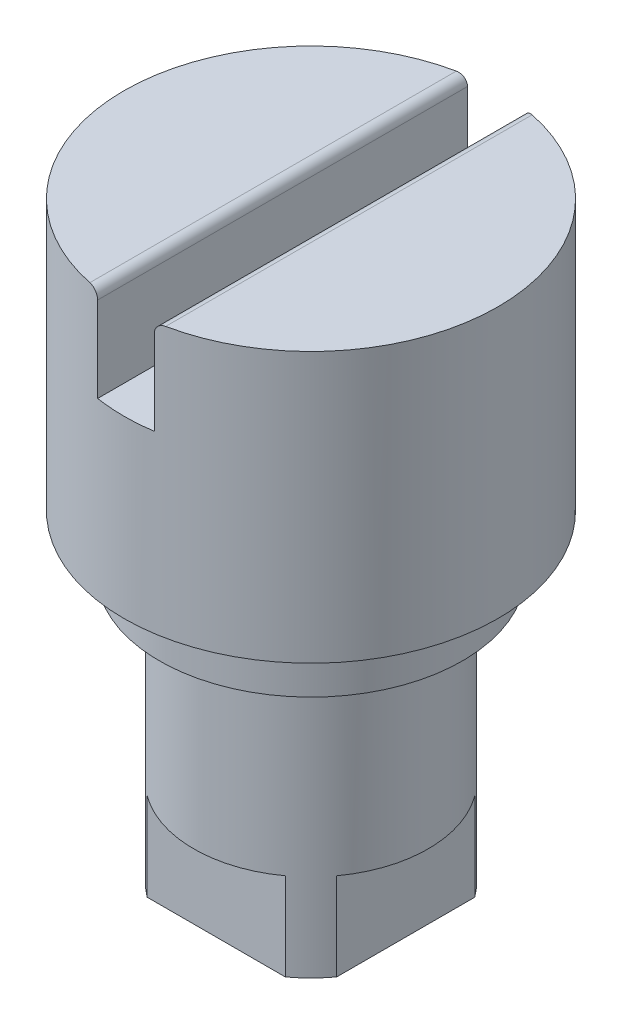
ISO-10303-21;
HEADER;
FILE_DESCRIPTION(('STEP AP214'),'2;1');
FILE_NAME('part.step','',(''),(''),'','','');
FILE_SCHEMA(('AUTOMOTIVE_DESIGN { 1 0 10303 214 1 1 1 1 }'));
ENDSEC;
DATA;
#1=APPLICATION_CONTEXT('core data for automotive mechanical design processes');
#2=APPLICATION_PROTOCOL_DEFINITION('international standard','automotive_design',2000,#1);
#3=PRODUCT_CONTEXT('',#1,'mechanical');
#4=PRODUCT('Part','Part','',(#3));
#5=PRODUCT_RELATED_PRODUCT_CATEGORY('part','',(#4));
#6=PRODUCT_DEFINITION_FORMATION('','',#4);
#7=PRODUCT_DEFINITION_CONTEXT('part definition',#1,'design');
#8=PRODUCT_DEFINITION('design','',#6,#7);
#9=PRODUCT_DEFINITION_SHAPE('','',#8);
#10=(LENGTH_UNIT() NAMED_UNIT(*) SI_UNIT(.MILLI.,.METRE.));
#11=(NAMED_UNIT(*) PLANE_ANGLE_UNIT() SI_UNIT($,.RADIAN.));
#12=(NAMED_UNIT(*) SI_UNIT($,.STERADIAN.) SOLID_ANGLE_UNIT());
#13=UNCERTAINTY_MEASURE_WITH_UNIT(LENGTH_MEASURE(1.E-05),#10,'distance_accuracy_value','');
#14=(GEOMETRIC_REPRESENTATION_CONTEXT(3) GLOBAL_UNCERTAINTY_ASSIGNED_CONTEXT((#13)) GLOBAL_UNIT_ASSIGNED_CONTEXT((#10,
#11,#12)) REPRESENTATION_CONTEXT('',''));
#15=CARTESIAN_POINT('',(0.,0.,0.));
#16=DIRECTION('',(0.,0.,1.));
#17=DIRECTION('',(1.,0.,0.));
#18=AXIS2_PLACEMENT_3D('',#15,#16,#17);
#19=CARTESIAN_POINT('',(0.,1.4,0.));
#20=DIRECTION('',(0.,1.,0.));
#21=DIRECTION('',(0.,0.,1.));
#22=AXIS2_PLACEMENT_3D('',#19,#20,#21);
#23=PLANE('',#22);
#24=CARTESIAN_POINT('',(0.,1.4,0.));
#25=DIRECTION('',(0.,1.,0.));
#26=DIRECTION('',(0.,0.,1.));
#27=AXIS2_PLACEMENT_3D('',#24,#25,#26);
#28=CIRCLE('',#27,2.5);
#29=CARTESIAN_POINT('',(0.,1.4,2.5));
#30=VERTEX_POINT('',#29);
#31=EDGE_CURVE('E20',#30,#30,#28,.F.);
#32=ORIENTED_EDGE('',*,*,#31,.T.);
#33=EDGE_LOOP('',(#32));
#34=FACE_BOUND('',#33,.T.);
#35=ADVANCED_FACE('F17',(#34),#23,.F.);
#36=CARTESIAN_POINT('',(0.,-13.6,0.));
#37=DIRECTION('',(0.,1.,0.));
#38=DIRECTION('',(0.,0.,1.));
#39=AXIS2_PLACEMENT_3D('',#36,#37,#38);
#40=CYLINDRICAL_SURFACE('',#39,2.5);
#41=ORIENTED_EDGE('',*,*,#31,.F.);
#42=EDGE_LOOP('',(#41));
#43=FACE_BOUND('',#42,.T.);
#44=CARTESIAN_POINT('',(0.,-12.7999999999133,0.));
#45=DIRECTION('',(0.,-1.,0.));
#46=DIRECTION('',(1.,0.,0.));
#47=AXIS2_PLACEMENT_3D('',#44,#45,#46);
#48=CIRCLE('',#47,2.50000000005457);
#49=CARTESIAN_POINT('',(2.50000000005457,-12.7999999999133,0.));
#50=VERTEX_POINT('',#49);
#51=EDGE_CURVE('E129',#50,#50,#48,.T.);
#52=ORIENTED_EDGE('',*,*,#51,.T.);
#53=EDGE_LOOP('',(#52));
#54=FACE_BOUND('',#53,.T.);
#55=ADVANCED_FACE('F289',(#43,#54),#40,.F.);
#56=CARTESIAN_POINT('',(0.,-13.5999999999967,0.));
#57=DIRECTION('',(0.,-1.,0.));
#58=DIRECTION('',(0.,0.,-1.));
#59=AXIS2_PLACEMENT_3D('',#56,#57,#58);
#60=CONICAL_SURFACE('',#59,3.30000000008113,0.785398163361921);
#61=ORIENTED_EDGE('',*,*,#51,.F.);
#62=EDGE_LOOP('',(#61));
#63=FACE_BOUND('',#62,.T.);
#64=CARTESIAN_POINT('',(0.,-13.5999999999967,0.));
#65=DIRECTION('',(0.,-1.,0.));
#66=DIRECTION('',(0.,0.,-1.));
#67=AXIS2_PLACEMENT_3D('',#64,#65,#66);
#68=CIRCLE('',#67,3.30000000008113);
#69=CARTESIAN_POINT('',(0.,-13.5999999999967,-3.30000000008113));
#70=VERTEX_POINT('',#69);
#71=EDGE_CURVE('E163',#70,#70,#68,.F.);
#72=ORIENTED_EDGE('',*,*,#71,.F.);
#73=EDGE_LOOP('',(#72));
#74=FACE_BOUND('',#73,.T.);
#75=ADVANCED_FACE('F286',(#63,#74),#60,.F.);
#76=CARTESIAN_POINT('',(0.,-13.6,0.));
#77=DIRECTION('',(0.,-1.,0.));
#78=DIRECTION('',(0.,0.,-1.));
#79=AXIS2_PLACEMENT_3D('',#76,#77,#78);
#80=PLANE('',#79);
#81=ORIENTED_EDGE('',*,*,#71,.T.);
#82=EDGE_LOOP('',(#81));
#83=FACE_BOUND('',#82,.T.);
#84=DIRECTION('',(-1.,0.,0.));
#85=VECTOR('',#84,1.);
#86=CARTESIAN_POINT('',(-4.,-13.6,4.));
#87=LINE('',#86,#85);
#88=CARTESIAN_POINT('',(2.91590466236478,-13.6,3.99999999999992));
#89=VERTEX_POINT('',#88);
#90=CARTESIAN_POINT('',(-2.91590466236478,-13.6,3.99999999999992));
#91=VERTEX_POINT('',#90);
#92=EDGE_CURVE('E168',#89,#91,#87,.T.);
#93=ORIENTED_EDGE('',*,*,#92,.T.);
#94=CARTESIAN_POINT('',(0.,-13.6,0.));
#95=DIRECTION('',(0.,-1.,0.));
#96=DIRECTION('',(0.,0.,-1.));
#97=AXIS2_PLACEMENT_3D('',#94,#95,#96);
#98=CIRCLE('',#97,4.95);
#99=CARTESIAN_POINT('',(-3.99999999999992,-13.6,2.91590466236478));
#100=VERTEX_POINT('',#99);
#101=EDGE_CURVE('E305',#91,#100,#98,.T.);
#102=ORIENTED_EDGE('',*,*,#101,.T.);
#103=DIRECTION('',(0.,0.,-1.));
#104=VECTOR('',#103,1.);
#105=CARTESIAN_POINT('',(-4.,-13.6,-4.));
#106=LINE('',#105,#104);
#107=CARTESIAN_POINT('',(-3.99999999999992,-13.6,-2.91590466236477));
#108=VERTEX_POINT('',#107);
#109=EDGE_CURVE('E126',#100,#108,#106,.T.);
#110=ORIENTED_EDGE('',*,*,#109,.T.);
#111=CARTESIAN_POINT('',(0.,-13.6,0.));
#112=DIRECTION('',(0.,-1.,0.));
#113=DIRECTION('',(0.,0.,-1.));
#114=AXIS2_PLACEMENT_3D('',#111,#112,#113);
#115=CIRCLE('',#114,4.95);
#116=CARTESIAN_POINT('',(-2.91590466236478,-13.6,-3.99999999999992));
#117=VERTEX_POINT('',#116);
#118=EDGE_CURVE('E116',#108,#117,#115,.T.);
#119=ORIENTED_EDGE('',*,*,#118,.T.);
#120=DIRECTION('',(1.,0.,0.));
#121=VECTOR('',#120,1.);
#122=CARTESIAN_POINT('',(4.,-13.6,-4.));
#123=LINE('',#122,#121);
#124=CARTESIAN_POINT('',(2.91590466236478,-13.6,-3.99999999999992));
#125=VERTEX_POINT('',#124);
#126=EDGE_CURVE('E123',#117,#125,#123,.T.);
#127=ORIENTED_EDGE('',*,*,#126,.T.);
#128=CARTESIAN_POINT('',(0.,-13.6,0.));
#129=DIRECTION('',(0.,-1.,0.));
#130=DIRECTION('',(0.,0.,-1.));
#131=AXIS2_PLACEMENT_3D('',#128,#129,#130);
#132=CIRCLE('',#131,4.95);
#133=CARTESIAN_POINT('',(3.99999999999992,-13.6,-2.91590466236478));
#134=VERTEX_POINT('',#133);
#135=EDGE_CURVE('E128',#125,#134,#132,.T.);
#136=ORIENTED_EDGE('',*,*,#135,.T.);
#137=DIRECTION('',(0.,0.,1.));
#138=VECTOR('',#137,1.);
#139=CARTESIAN_POINT('',(4.,-13.6,4.));
#140=LINE('',#139,#138);
#141=CARTESIAN_POINT('',(3.99999999999992,-13.6,2.91590466236478));
#142=VERTEX_POINT('',#141);
#143=EDGE_CURVE('E151',#134,#142,#140,.T.);
#144=ORIENTED_EDGE('',*,*,#143,.T.);
#145=CARTESIAN_POINT('',(0.,-13.6,0.));
#146=DIRECTION('',(0.,-1.,0.));
#147=DIRECTION('',(0.,0.,-1.));
#148=AXIS2_PLACEMENT_3D('',#145,#146,#147);
#149=CIRCLE('',#148,4.95);
#150=EDGE_CURVE('E307',#142,#89,#149,.T.);
#151=ORIENTED_EDGE('',*,*,#150,.T.);
#152=EDGE_LOOP('',(#93,#102,#110,#119,#127,#136,#144,#151));
#153=FACE_BOUND('',#152,.T.);
#154=ADVANCED_FACE('F122',(#83,#153),#80,.T.);
#155=CARTESIAN_POINT('',(0.,-9.9,0.));
#156=DIRECTION('',(0.,-1.,0.));
#157=DIRECTION('',(0.,0.,-1.));
#158=AXIS2_PLACEMENT_3D('',#155,#156,#157);
#159=PLANE('',#158);
#160=CARTESIAN_POINT('',(0.,-9.9,0.));
#161=DIRECTION('',(0.,-1.,0.));
#162=DIRECTION('',(0.,0.,-1.));
#163=AXIS2_PLACEMENT_3D('',#160,#161,#162);
#164=CIRCLE('',#163,4.95);
#165=CARTESIAN_POINT('',(-2.91590466236478,-9.9,3.99999999999992));
#166=VERTEX_POINT('',#165);
#167=CARTESIAN_POINT('',(2.91590466236478,-9.9,3.99999999999992));
#168=VERTEX_POINT('',#167);
#169=EDGE_CURVE('E176',#166,#168,#164,.F.);
#170=ORIENTED_EDGE('',*,*,#169,.F.);
#171=DIRECTION('',(-1.,0.,0.));
#172=VECTOR('',#171,1.);
#173=CARTESIAN_POINT('',(-4.,-9.9,4.));
#174=LINE('',#173,#172);
#175=EDGE_CURVE('E166',#166,#168,#174,.F.);
#176=ORIENTED_EDGE('',*,*,#175,.T.);
#177=EDGE_LOOP('',(#170,#176));
#178=FACE_BOUND('',#177,.T.);
#179=ADVANCED_FACE('F279',(#178),#159,.T.);
#180=CARTESIAN_POINT('',(0.,-9.9,0.));
#181=DIRECTION('',(0.,-1.,0.));
#182=DIRECTION('',(0.,0.,-1.));
#183=AXIS2_PLACEMENT_3D('',#180,#181,#182);
#184=PLANE('',#183);
#185=CARTESIAN_POINT('',(0.,-9.9,0.));
#186=DIRECTION('',(0.,-1.,0.));
#187=DIRECTION('',(0.,0.,-1.));
#188=AXIS2_PLACEMENT_3D('',#185,#186,#187);
#189=CIRCLE('',#188,4.95);
#190=CARTESIAN_POINT('',(3.99999999999992,-9.9,2.91590466236478));
#191=VERTEX_POINT('',#190);
#192=CARTESIAN_POINT('',(3.99999999999992,-9.9,-2.91590466236478));
#193=VERTEX_POINT('',#192);
#194=EDGE_CURVE('E156',#191,#193,#189,.F.);
#195=ORIENTED_EDGE('',*,*,#194,.F.);
#196=DIRECTION('',(0.,0.,1.));
#197=VECTOR('',#196,1.);
#198=CARTESIAN_POINT('',(4.,-9.9,4.));
#199=LINE('',#198,#197);
#200=EDGE_CURVE('E161',#191,#193,#199,.F.);
#201=ORIENTED_EDGE('',*,*,#200,.T.);
#202=EDGE_LOOP('',(#195,#201));
#203=FACE_BOUND('',#202,.T.);
#204=ADVANCED_FACE('F275',(#203),#184,.T.);
#205=CARTESIAN_POINT('',(4.,-13.6,4.));
#206=DIRECTION('',(-1.,0.,0.));
#207=DIRECTION('',(0.,0.,1.));
#208=AXIS2_PLACEMENT_3D('',#205,#206,#207);
#209=PLANE('',#208);
#210=DIRECTION('',(0.,-1.,0.));
#211=VECTOR('',#210,1.);
#212=CARTESIAN_POINT('',(3.99999999999984,-2.3,-2.91590466236488));
#213=LINE('',#212,#211);
#214=EDGE_CURVE('E158',#193,#134,#213,.T.);
#215=ORIENTED_EDGE('',*,*,#214,.F.);
#216=ORIENTED_EDGE('',*,*,#200,.F.);
#217=DIRECTION('',(0.,-1.,0.));
#218=VECTOR('',#217,1.);
#219=CARTESIAN_POINT('',(3.99999999999984,-2.3,2.91590466236488));
#220=LINE('',#219,#218);
#221=EDGE_CURVE('E153',#142,#191,#220,.F.);
#222=ORIENTED_EDGE('',*,*,#221,.F.);
#223=ORIENTED_EDGE('',*,*,#143,.F.);
#224=EDGE_LOOP('',(#215,#216,#222,#223));
#225=FACE_BOUND('',#224,.T.);
#226=ADVANCED_FACE('F271',(#225),#209,.F.);
#227=CARTESIAN_POINT('',(0.,-9.9,0.));
#228=DIRECTION('',(0.,-1.,0.));
#229=DIRECTION('',(0.,0.,-1.));
#230=AXIS2_PLACEMENT_3D('',#227,#228,#229);
#231=PLANE('',#230);
#232=CARTESIAN_POINT('',(0.,-9.9,0.));
#233=DIRECTION('',(0.,-1.,0.));
#234=DIRECTION('',(0.,0.,-1.));
#235=AXIS2_PLACEMENT_3D('',#232,#233,#234);
#236=CIRCLE('',#235,4.95);
#237=CARTESIAN_POINT('',(2.91590466236478,-9.9,-3.99999999999992));
#238=VERTEX_POINT('',#237);
#239=CARTESIAN_POINT('',(-2.91590466236478,-9.9,-3.99999999999992));
#240=VERTEX_POINT('',#239);
#241=EDGE_CURVE('E142',#238,#240,#236,.F.);
#242=ORIENTED_EDGE('',*,*,#241,.F.);
#243=DIRECTION('',(1.,0.,0.));
#244=VECTOR('',#243,1.);
#245=CARTESIAN_POINT('',(4.,-9.9,-4.));
#246=LINE('',#245,#244);
#247=EDGE_CURVE('E138',#238,#240,#246,.F.);
#248=ORIENTED_EDGE('',*,*,#247,.T.);
#249=EDGE_LOOP('',(#242,#248));
#250=FACE_BOUND('',#249,.T.);
#251=ADVANCED_FACE('F268',(#250),#231,.T.);
#252=CARTESIAN_POINT('',(4.,-13.6,-4.));
#253=DIRECTION('',(0.,0.,1.));
#254=DIRECTION('',(1.,0.,0.));
#255=AXIS2_PLACEMENT_3D('',#252,#253,#254);
#256=PLANE('',#255);
#257=DIRECTION('',(0.,-1.,0.));
#258=VECTOR('',#257,1.);
#259=CARTESIAN_POINT('',(-2.91590466236489,-2.3,-3.99999999999984));
#260=LINE('',#259,#258);
#261=EDGE_CURVE('E133',#240,#117,#260,.T.);
#262=ORIENTED_EDGE('',*,*,#261,.F.);
#263=ORIENTED_EDGE('',*,*,#247,.F.);
#264=DIRECTION('',(0.,-1.,0.));
#265=VECTOR('',#264,1.);
#266=CARTESIAN_POINT('',(2.91590466236488,-2.3,-3.99999999999984));
#267=LINE('',#266,#265);
#268=EDGE_CURVE('E136',#125,#238,#267,.F.);
#269=ORIENTED_EDGE('',*,*,#268,.F.);
#270=ORIENTED_EDGE('',*,*,#126,.F.);
#271=EDGE_LOOP('',(#262,#263,#269,#270));
#272=FACE_BOUND('',#271,.T.);
#273=ADVANCED_FACE('F132',(#272),#256,.F.);
#274=CARTESIAN_POINT('',(0.,-9.9,0.));
#275=DIRECTION('',(0.,-1.,0.));
#276=DIRECTION('',(0.,0.,-1.));
#277=AXIS2_PLACEMENT_3D('',#274,#275,#276);
#278=PLANE('',#277);
#279=CARTESIAN_POINT('',(0.,-9.9,0.));
#280=DIRECTION('',(0.,-1.,0.));
#281=DIRECTION('',(0.,0.,-1.));
#282=AXIS2_PLACEMENT_3D('',#279,#280,#281);
#283=CIRCLE('',#282,4.95);
#284=CARTESIAN_POINT('',(-3.99999999999992,-9.9,-2.91590466236477));
#285=VERTEX_POINT('',#284);
#286=CARTESIAN_POINT('',(-3.99999999999992,-9.9,2.91590466236478));
#287=VERTEX_POINT('',#286);
#288=EDGE_CURVE('E145',#285,#287,#283,.F.);
#289=ORIENTED_EDGE('',*,*,#288,.F.);
#290=DIRECTION('',(0.,0.,-1.));
#291=VECTOR('',#290,1.);
#292=CARTESIAN_POINT('',(-4.,-9.9,-4.));
#293=LINE('',#292,#291);
#294=EDGE_CURVE('E137',#285,#287,#293,.F.);
#295=ORIENTED_EDGE('',*,*,#294,.T.);
#296=EDGE_LOOP('',(#289,#295));
#297=FACE_BOUND('',#296,.T.);
#298=ADVANCED_FACE('F261',(#297),#278,.T.);
#299=CARTESIAN_POINT('',(-4.,-13.6,-4.));
#300=DIRECTION('',(1.,0.,0.));
#301=DIRECTION('',(0.,0.,-1.));
#302=AXIS2_PLACEMENT_3D('',#299,#300,#301);
#303=PLANE('',#302);
#304=DIRECTION('',(0.,-1.,0.));
#305=VECTOR('',#304,1.);
#306=CARTESIAN_POINT('',(-3.99999999999984,-2.3,2.91590466236488));
#307=LINE('',#306,#305);
#308=EDGE_CURVE('E173',#287,#100,#307,.T.);
#309=ORIENTED_EDGE('',*,*,#308,.F.);
#310=ORIENTED_EDGE('',*,*,#294,.F.);
#311=DIRECTION('',(0.,-1.,0.));
#312=VECTOR('',#311,1.);
#313=CARTESIAN_POINT('',(-3.99999999999984,-2.3,-2.91590466236488));
#314=LINE('',#313,#312);
#315=EDGE_CURVE('E143',#108,#285,#314,.F.);
#316=ORIENTED_EDGE('',*,*,#315,.F.);
#317=ORIENTED_EDGE('',*,*,#109,.F.);
#318=EDGE_LOOP('',(#309,#310,#316,#317));
#319=FACE_BOUND('',#318,.T.);
#320=ADVANCED_FACE('F257',(#319),#303,.F.);
#321=CARTESIAN_POINT('',(-4.,-13.6,4.));
#322=DIRECTION('',(0.,0.,-1.));
#323=DIRECTION('',(-1.,0.,0.));
#324=AXIS2_PLACEMENT_3D('',#321,#322,#323);
#325=PLANE('',#324);
#326=DIRECTION('',(0.,-1.,0.));
#327=VECTOR('',#326,1.);
#328=CARTESIAN_POINT('',(2.91590466236488,-2.3,3.99999999999984));
#329=LINE('',#328,#327);
#330=EDGE_CURVE('E157',#168,#89,#329,.T.);
#331=ORIENTED_EDGE('',*,*,#330,.F.);
#332=ORIENTED_EDGE('',*,*,#175,.F.);
#333=DIRECTION('',(0.,-1.,0.));
#334=VECTOR('',#333,1.);
#335=CARTESIAN_POINT('',(-2.91590466236488,-2.3,3.99999999999984));
#336=LINE('',#335,#334);
#337=EDGE_CURVE('E169',#91,#166,#336,.F.);
#338=ORIENTED_EDGE('',*,*,#337,.F.);
#339=ORIENTED_EDGE('',*,*,#92,.F.);
#340=EDGE_LOOP('',(#331,#332,#338,#339));
#341=FACE_BOUND('',#340,.T.);
#342=ADVANCED_FACE('F253',(#341),#325,.F.);
#343=CARTESIAN_POINT('',(0.,-2.3,0.));
#344=DIRECTION('',(0.,-1.,0.));
#345=DIRECTION('',(0.,0.,-1.));
#346=AXIS2_PLACEMENT_3D('',#343,#344,#345);
#347=CYLINDRICAL_SURFACE('',#346,4.95);
#348=CARTESIAN_POINT('',(0.,-2.3,0.));
#349=DIRECTION('',(0.,-1.,0.));
#350=DIRECTION('',(0.,0.,-1.));
#351=AXIS2_PLACEMENT_3D('',#348,#349,#350);
#352=CIRCLE('',#351,4.95);
#353=CARTESIAN_POINT('',(0.,-2.3,-4.95));
#354=VERTEX_POINT('',#353);
#355=EDGE_CURVE('E172',#354,#354,#352,.F.);
#356=ORIENTED_EDGE('',*,*,#355,.F.);
#357=EDGE_LOOP('',(#356));
#358=FACE_BOUND('',#357,.T.);
#359=ORIENTED_EDGE('',*,*,#101,.F.);
#360=ORIENTED_EDGE('',*,*,#337,.T.);
#361=ORIENTED_EDGE('',*,*,#169,.T.);
#362=ORIENTED_EDGE('',*,*,#330,.T.);
#363=ORIENTED_EDGE('',*,*,#150,.F.);
#364=ORIENTED_EDGE('',*,*,#221,.T.);
#365=ORIENTED_EDGE('',*,*,#194,.T.);
#366=ORIENTED_EDGE('',*,*,#214,.T.);
#367=ORIENTED_EDGE('',*,*,#135,.F.);
#368=ORIENTED_EDGE('',*,*,#268,.T.);
#369=ORIENTED_EDGE('',*,*,#241,.T.);
#370=ORIENTED_EDGE('',*,*,#261,.T.);
#371=ORIENTED_EDGE('',*,*,#118,.F.);
#372=ORIENTED_EDGE('',*,*,#315,.T.);
#373=ORIENTED_EDGE('',*,*,#288,.T.);
#374=ORIENTED_EDGE('',*,*,#308,.T.);
#375=EDGE_LOOP('',(#359,#360,#361,#362,#363,#364,#365,#366,#367,#368,#369,#370,#371,#372,#373,#374));
#376=FACE_BOUND('',#375,.T.);
#377=ADVANCED_FACE('F140',(#358,#376),#347,.T.);
#378=CARTESIAN_POINT('',(0.,-2.3,0.));
#379=DIRECTION('',(0.,-1.,0.));
#380=DIRECTION('',(0.,0.,-1.));
#381=AXIS2_PLACEMENT_3D('',#378,#379,#380);
#382=PLANE('',#381);
#383=ORIENTED_EDGE('',*,*,#355,.T.);
#384=EDGE_LOOP('',(#383));
#385=FACE_BOUND('',#384,.T.);
#386=CARTESIAN_POINT('',(0.,-2.3,0.));
#387=DIRECTION('',(0.,-1.,0.));
#388=DIRECTION('',(0.,0.,-1.));
#389=AXIS2_PLACEMENT_3D('',#386,#387,#388);
#390=CIRCLE('',#389,6.4);
#391=CARTESIAN_POINT('',(0.,-2.3,-6.4));
#392=VERTEX_POINT('',#391);
#393=EDGE_CURVE('E201',#392,#392,#390,.F.);
#394=ORIENTED_EDGE('',*,*,#393,.F.);
#395=EDGE_LOOP('',(#394));
#396=FACE_BOUND('',#395,.T.);
#397=ADVANCED_FACE('F245',(#385,#396),#382,.T.);
#398=CARTESIAN_POINT('',(1.6,11.,-7.859899480753));
#399=DIRECTION('',(0.,0.,1.));
#400=DIRECTION('',(1.,0.,0.));
#401=AXIS2_PLACEMENT_3D('',#398,#399,#400);
#402=CYLINDRICAL_SURFACE('',#401,0.4);
#403=DIRECTION('',(0.,0.,1.));
#404=VECTOR('',#403,1.);
#405=CARTESIAN_POINT('',(1.2,11.,-7.808328886516));
#406=LINE('',#405,#404);
#407=CARTESIAN_POINT('',(1.2,11.,7.80832888651599));
#408=VERTEX_POINT('',#407);
#409=CARTESIAN_POINT('',(1.2,11.,-7.80832888651599));
#410=VERTEX_POINT('',#409);
#411=EDGE_CURVE('E325',#408,#410,#406,.F.);
#412=ORIENTED_EDGE('',*,*,#411,.F.);
#413=CARTESIAN_POINT('',(1.2,11.,7.80832888651599));
#414=CARTESIAN_POINT('',(1.19997995855991,11.0222947194468,7.80832924495079));
#415=CARTESIAN_POINT('',(1.20186272072636,11.0445826679353,7.80804257730045));
#416=CARTESIAN_POINT('',(1.20928483373222,11.0885031270626,7.8068979428289));
#417=CARTESIAN_POINT('',(1.21482036067191,11.1101362984128,7.80604057343905));
#418=CARTESIAN_POINT('',(1.22940248321437,11.1521629415984,7.80375682071756));
#419=CARTESIAN_POINT('',(1.2384504892257,11.1725559116312,7.80233020880459));
#420=CARTESIAN_POINT('',(1.25977650779727,11.2115204510364,7.79891531460332));
#421=CARTESIAN_POINT('',(1.27205416566317,11.2300922201137,7.79692709399155));
#422=CARTESIAN_POINT('',(1.29952893506674,11.2649756631782,7.79239490385581));
#423=CARTESIAN_POINT('',(1.31473737347756,11.2812781314555,7.78984877271005));
#424=CARTESIAN_POINT('',(1.34759382547291,11.3111003458617,7.78423202157586));
#425=CARTESIAN_POINT('',(1.36524228107001,11.3246195866981,7.78116130653451));
#426=CARTESIAN_POINT('',(1.40267315045542,11.3486582095846,7.77450146299269));
#427=CARTESIAN_POINT('',(1.42247733806708,11.3591421313834,7.77090689086787));
#428=CARTESIAN_POINT('',(1.46348338674214,11.3766427107057,7.76328863695317));
#429=CARTESIAN_POINT('',(1.48468485689293,11.3836603333549,7.75926507498723));
#430=CARTESIAN_POINT('',(1.52164905904666,11.3925703741129,7.75208549260331));
#431=CARTESIAN_POINT('',(1.5372191935789,11.3953568484454,7.74901344030867));
#432=CARTESIAN_POINT('',(1.56852809295634,11.3990715154098,7.74273706708263));
#433=CARTESIAN_POINT('',(1.58426656126264,11.4000025625219,7.73953295707964));
#434=CARTESIAN_POINT('',(1.59999999999992,11.4,7.73627817493659));
#435=B_SPLINE_CURVE_WITH_KNOTS('',3,(#413,#414,#415,#416,#417,#418,#419,#420,#421,#422,#423,
#424,#425,#426,#427,#428,#429,#430,#431,#432,#433,#434),.UNSPECIFIED.,.F.,.F.,(4,2,2,2,2,2,2,2,
2,2,4),(0.,0.0667930524603493,0.133516293252322,0.200266353999884,0.267009087025336,
0.334015136824415,0.401033340807543,0.468805516036878,0.536558810725714,0.584794962934658,
0.632956848819899),.UNSPECIFIED.);
#436=CARTESIAN_POINT('',(1.59999999999996,11.4,7.73627817493659));
#437=VERTEX_POINT('',#436);
#438=EDGE_CURVE('E232',#408,#437,#435,.T.);
#439=ORIENTED_EDGE('',*,*,#438,.T.);
#440=DIRECTION('',(0.,0.,1.));
#441=VECTOR('',#440,1.);
#442=CARTESIAN_POINT('',(1.6,11.4,0.));
#443=LINE('',#442,#441);
#444=CARTESIAN_POINT('',(1.59999999999996,11.4,-7.73627817493659));
#445=VERTEX_POINT('',#444);
#446=EDGE_CURVE('E204',#445,#437,#443,.T.);
#447=ORIENTED_EDGE('',*,*,#446,.F.);
#448=CARTESIAN_POINT('',(1.59999999999992,11.4,-7.73627817493659));
#449=CARTESIAN_POINT('',(1.57732078435825,11.4000184692137,-7.74097266828872));
#450=CARTESIAN_POINT('',(1.5546193721075,11.3980720483802,-7.74555980733414));
#451=CARTESIAN_POINT('',(1.50981333641904,11.3903577266488,-7.75441606940681));
#452=CARTESIAN_POINT('',(1.48770867099443,11.3845900953431,-7.75868521484537));
#453=CARTESIAN_POINT('',(1.44471513806717,11.369334956705,-7.76680642351701));
#454=CARTESIAN_POINT('',(1.42382735080016,11.3598442004095,-7.7706581187077));
#455=CARTESIAN_POINT('',(1.38392314060388,11.337393437274,-7.77786390693471));
#456=CARTESIAN_POINT('',(1.36490592553409,11.3244349076746,-7.78121821091187));
#457=CARTESIAN_POINT('',(1.3295446983048,11.2955811475413,-7.78733778704554));
#458=CARTESIAN_POINT('',(1.31317006910881,11.2797249081155,-7.79010993786262));
#459=CARTESIAN_POINT('',(1.28330979714611,11.2454069306749,-7.79508471297141));
#460=CARTESIAN_POINT('',(1.26982469425762,11.2269447068259,-7.79728723084896));
#461=CARTESIAN_POINT('',(1.24634936271265,11.1882446314604,-7.80107384106345));
#462=CARTESIAN_POINT('',(1.23630989174707,11.1680374578739,-7.80266668800478));
#463=CARTESIAN_POINT('',(1.21976414774516,11.1261974253528,-7.80527040570002));
#464=CARTESIAN_POINT('',(1.2132551798598,11.1045656679938,-7.80628172037571));
#465=CARTESIAN_POINT('',(1.20574807483213,11.0689797943392,-7.80744386856422));
#466=CARTESIAN_POINT('',(1.20359371159733,11.0552646494799,-7.80777597844575));
#467=CARTESIAN_POINT('',(1.2007200569053,11.027701735182,-7.808218236358));
#468=CARTESIAN_POINT('',(1.19999865940359,11.0138541904771,-7.80832871013198));
#469=CARTESIAN_POINT('',(1.2,11.,-7.80832888651599));
#470=B_SPLINE_CURVE_WITH_KNOTS('',3,(#448,#449,#450,#451,#452,#453,#454,#455,#456,#457,#458,
#459,#460,#461,#462,#463,#464,#465,#466,#467,#468,#469),.UNSPECIFIED.,.F.,.F.,(4,2,2,2,2,2,2,2,
2,2,4),(0.,0.0693985645085393,0.138792233363338,0.208246593386451,0.277671413441485,
0.346222940753307,0.414787265065096,0.482326377670523,0.549813864555712,0.591405405039217,
0.632935772646212),.UNSPECIFIED.);
#471=EDGE_CURVE('E236',#445,#410,#470,.T.);
#472=ORIENTED_EDGE('',*,*,#471,.T.);
#473=EDGE_LOOP('',(#412,#439,#447,#472));
#474=FACE_BOUND('',#473,.T.);
#475=ADVANCED_FACE('F241',(#474),#402,.T.);
#476=CARTESIAN_POINT('',(-1.6,11.,7.857915377198));
#477=DIRECTION('',(0.,0.,-1.));
#478=DIRECTION('',(-1.,0.,0.));
#479=AXIS2_PLACEMENT_3D('',#476,#477,#478);
#480=CYLINDRICAL_SURFACE('',#479,0.4);
#481=DIRECTION('',(0.,0.,-1.));
#482=VECTOR('',#481,1.);
#483=CARTESIAN_POINT('',(-1.2,11.,7.808328886516));
#484=LINE('',#483,#482);
#485=CARTESIAN_POINT('',(-1.2,11.,-7.80832888651599));
#486=VERTEX_POINT('',#485);
#487=CARTESIAN_POINT('',(-1.2,11.,7.80832888651599));
#488=VERTEX_POINT('',#487);
#489=EDGE_CURVE('E344',#486,#488,#484,.F.);
#490=ORIENTED_EDGE('',*,*,#489,.F.);
#491=CARTESIAN_POINT('',(-1.2,11.,-7.80832888651599));
#492=CARTESIAN_POINT('',(-1.19997995855991,11.0222947194468,-7.80832924495079));
#493=CARTESIAN_POINT('',(-1.20186272072636,11.0445826679353,-7.80804257730045));
#494=CARTESIAN_POINT('',(-1.20928483373222,11.0885031270626,-7.8068979428289));
#495=CARTESIAN_POINT('',(-1.21482036067191,11.1101362984128,-7.80604057343905));
#496=CARTESIAN_POINT('',(-1.22940248321437,11.1521629415984,-7.80375682071756));
#497=CARTESIAN_POINT('',(-1.2384504892257,11.1725559116312,-7.80233020880459));
#498=CARTESIAN_POINT('',(-1.25977650779727,11.2115204510364,-7.79891531460332));
#499=CARTESIAN_POINT('',(-1.27205416566317,11.2300922201137,-7.79692709399155));
#500=CARTESIAN_POINT('',(-1.29952893506674,11.2649756631782,-7.79239490385581));
#501=CARTESIAN_POINT('',(-1.31473737347756,11.2812781314555,-7.78984877271005));
#502=CARTESIAN_POINT('',(-1.34759382547291,11.3111003458617,-7.78423202157586));
#503=CARTESIAN_POINT('',(-1.36524228107001,11.3246195866981,-7.78116130653451));
#504=CARTESIAN_POINT('',(-1.40267315045542,11.3486582095846,-7.77450146299269));
#505=CARTESIAN_POINT('',(-1.42247733806708,11.3591421313834,-7.77090689086787));
#506=CARTESIAN_POINT('',(-1.46348338674214,11.3766427107057,-7.76328863695317));
#507=CARTESIAN_POINT('',(-1.48468485689293,11.3836603333549,-7.75926507498724));
#508=CARTESIAN_POINT('',(-1.52164905904666,11.3925703741129,-7.75208549260332));
#509=CARTESIAN_POINT('',(-1.5372191935789,11.3953568484454,-7.74901344030867));
#510=CARTESIAN_POINT('',(-1.56852809295634,11.3990715154098,-7.74273706708263));
#511=CARTESIAN_POINT('',(-1.58426656126264,11.4000025625219,-7.73953295707964));
#512=CARTESIAN_POINT('',(-1.59999999999991,11.4,-7.73627817493659));
#513=B_SPLINE_CURVE_WITH_KNOTS('',3,(#491,#492,#493,#494,#495,#496,#497,#498,#499,#500,#501,
#502,#503,#504,#505,#506,#507,#508,#509,#510,#511,#512),.UNSPECIFIED.,.F.,.F.,(4,2,2,2,2,2,2,2,
2,2,4),(0.,0.0667930524603493,0.133516293252322,0.200266353999884,0.267009087025336,
0.334015136824416,0.401033340807543,0.468805516036879,0.536558810725715,0.584794962934657,
0.632956848819897),.UNSPECIFIED.);
#514=CARTESIAN_POINT('',(-1.59999999999996,11.4,-7.73627817493659));
#515=VERTEX_POINT('',#514);
#516=EDGE_CURVE('E205',#486,#515,#513,.T.);
#517=ORIENTED_EDGE('',*,*,#516,.T.);
#518=DIRECTION('',(0.,0.,1.));
#519=VECTOR('',#518,1.);
#520=CARTESIAN_POINT('',(-1.6,11.4,0.));
#521=LINE('',#520,#519);
#522=CARTESIAN_POINT('',(-1.59999999999996,11.4,7.73627817493659));
#523=VERTEX_POINT('',#522);
#524=EDGE_CURVE('E335',#523,#515,#521,.F.);
#525=ORIENTED_EDGE('',*,*,#524,.F.);
#526=CARTESIAN_POINT('',(-1.59999999999992,11.4,7.73627817493659));
#527=CARTESIAN_POINT('',(-1.57732078435825,11.4000184692137,7.74097266828872));
#528=CARTESIAN_POINT('',(-1.5546193721075,11.3980720483802,7.74555980733414));
#529=CARTESIAN_POINT('',(-1.50981333641905,11.3903577266488,7.75441606940681));
#530=CARTESIAN_POINT('',(-1.48770867099443,11.3845900953431,7.75868521484537));
#531=CARTESIAN_POINT('',(-1.44471513806717,11.369334956705,7.76680642351701));
#532=CARTESIAN_POINT('',(-1.42382735080016,11.3598442004095,7.7706581187077));
#533=CARTESIAN_POINT('',(-1.38392314060388,11.337393437274,7.77786390693471));
#534=CARTESIAN_POINT('',(-1.36490592553409,11.3244349076746,7.78121821091187));
#535=CARTESIAN_POINT('',(-1.3295446983048,11.2955811475413,7.78733778704554));
#536=CARTESIAN_POINT('',(-1.31317006910881,11.2797249081155,7.79010993786262));
#537=CARTESIAN_POINT('',(-1.28330979714611,11.2454069306749,7.79508471297141));
#538=CARTESIAN_POINT('',(-1.26982469425762,11.2269447068259,7.79728723084896));
#539=CARTESIAN_POINT('',(-1.24634936271265,11.1882446314604,7.80107384106345));
#540=CARTESIAN_POINT('',(-1.23630989174707,11.1680374578739,7.80266668800478));
#541=CARTESIAN_POINT('',(-1.21976414774516,11.1261974253528,7.80527040570002));
#542=CARTESIAN_POINT('',(-1.2132551798598,11.1045656679938,7.80628172037571));
#543=CARTESIAN_POINT('',(-1.20574807483213,11.0689797943392,7.80744386856422));
#544=CARTESIAN_POINT('',(-1.20359371159733,11.0552646494799,7.80777597844575));
#545=CARTESIAN_POINT('',(-1.2007200569053,11.027701735182,7.808218236358));
#546=CARTESIAN_POINT('',(-1.19999865940359,11.0138541904771,7.80832871013198));
#547=CARTESIAN_POINT('',(-1.2,11.,7.80832888651599));
#548=B_SPLINE_CURVE_WITH_KNOTS('',3,(#526,#527,#528,#529,#530,#531,#532,#533,#534,#535,#536,
#537,#538,#539,#540,#541,#542,#543,#544,#545,#546,#547),.UNSPECIFIED.,.F.,.F.,(4,2,2,2,2,2,2,2,
2,2,4),(0.,0.0693985645085391,0.138792233363338,0.208246593386451,0.277671413441484,
0.346222940753307,0.414787265065096,0.482326377670523,0.549813864555713,0.591405405039219,
0.632935772646212),.UNSPECIFIED.);
#549=EDGE_CURVE('E212',#523,#488,#548,.T.);
#550=ORIENTED_EDGE('',*,*,#549,.T.);
#551=EDGE_LOOP('',(#490,#517,#525,#550));
#552=FACE_BOUND('',#551,.T.);
#553=ADVANCED_FACE('F217',(#552),#480,.T.);
#554=CARTESIAN_POINT('',(0.,0.,0.));
#555=DIRECTION('',(0.,-1.,0.));
#556=DIRECTION('',(0.,0.,-1.));
#557=AXIS2_PLACEMENT_3D('',#554,#555,#556);
#558=CYLINDRICAL_SURFACE('',#557,6.4);
#559=ORIENTED_EDGE('',*,*,#393,.T.);
#560=EDGE_LOOP('',(#559));
#561=FACE_BOUND('',#560,.T.);
#562=CARTESIAN_POINT('',(0.,0.,0.));
#563=DIRECTION('',(0.,-1.,0.));
#564=DIRECTION('',(0.,0.,-1.));
#565=AXIS2_PLACEMENT_3D('',#562,#563,#564);
#566=CIRCLE('',#565,6.4);
#567=CARTESIAN_POINT('',(0.,0.,-6.4));
#568=VERTEX_POINT('',#567);
#569=EDGE_CURVE('E197',#568,#568,#566,.T.);
#570=ORIENTED_EDGE('',*,*,#569,.T.);
#571=EDGE_LOOP('',(#570));
#572=FACE_BOUND('',#571,.T.);
#573=ADVANCED_FACE('F383',(#561,#572),#558,.T.);
#574=CARTESIAN_POINT('',(0.,11.4,0.));
#575=DIRECTION('',(0.,1.,0.));
#576=DIRECTION('',(0.,0.,1.));
#577=AXIS2_PLACEMENT_3D('',#574,#575,#576);
#578=PLANE('',#577);
#579=ORIENTED_EDGE('',*,*,#446,.T.);
#580=CARTESIAN_POINT('',(0.,11.4,0.));
#581=DIRECTION('',(0.,1.,0.));
#582=DIRECTION('',(0.,0.,1.));
#583=AXIS2_PLACEMENT_3D('',#580,#581,#582);
#584=CIRCLE('',#583,7.9);
#585=EDGE_CURVE('E193',#445,#437,#584,.F.);
#586=ORIENTED_EDGE('',*,*,#585,.F.);
#587=EDGE_LOOP('',(#579,#586));
#588=FACE_BOUND('',#587,.T.);
#589=ADVANCED_FACE('F360',(#588),#578,.T.);
#590=CARTESIAN_POINT('',(1.2,4.4,-7.808328886516));
#591=DIRECTION('',(-1.,0.,0.));
#592=DIRECTION('',(0.,0.,1.));
#593=AXIS2_PLACEMENT_3D('',#590,#591,#592);
#594=PLANE('',#593);
#595=ORIENTED_EDGE('',*,*,#411,.T.);
#596=DIRECTION('',(0.,1.,0.));
#597=VECTOR('',#596,1.);
#598=CARTESIAN_POINT('',(1.2,0.,-7.80832888651599));
#599=LINE('',#598,#597);
#600=CARTESIAN_POINT('',(1.2,7.4,-7.80832888651599));
#601=VERTEX_POINT('',#600);
#602=EDGE_CURVE('E196',#601,#410,#599,.T.);
#603=ORIENTED_EDGE('',*,*,#602,.F.);
#604=DIRECTION('',(0.,0.,1.));
#605=VECTOR('',#604,1.);
#606=CARTESIAN_POINT('',(1.2,7.4,0.));
#607=LINE('',#606,#605);
#608=CARTESIAN_POINT('',(1.2,7.4,7.80832888651599));
#609=VERTEX_POINT('',#608);
#610=EDGE_CURVE('E200',#609,#601,#607,.F.);
#611=ORIENTED_EDGE('',*,*,#610,.F.);
#612=DIRECTION('',(0.,1.,0.));
#613=VECTOR('',#612,1.);
#614=CARTESIAN_POINT('',(1.2,0.,7.80832888651599));
#615=LINE('',#614,#613);
#616=EDGE_CURVE('E192',#408,#609,#615,.F.);
#617=ORIENTED_EDGE('',*,*,#616,.F.);
#618=EDGE_LOOP('',(#595,#603,#611,#617));
#619=FACE_BOUND('',#618,.T.);
#620=ADVANCED_FACE('F332',(#619),#594,.T.);
#621=CARTESIAN_POINT('',(0.,11.4,0.));
#622=DIRECTION('',(0.,1.,0.));
#623=DIRECTION('',(0.,0.,1.));
#624=AXIS2_PLACEMENT_3D('',#621,#622,#623);
#625=PLANE('',#624);
#626=ORIENTED_EDGE('',*,*,#524,.T.);
#627=CARTESIAN_POINT('',(0.,11.4,0.));
#628=DIRECTION('',(0.,1.,0.));
#629=DIRECTION('',(0.,0.,1.));
#630=AXIS2_PLACEMENT_3D('',#627,#628,#629);
#631=CIRCLE('',#630,7.9);
#632=EDGE_CURVE('E185',#523,#515,#631,.F.);
#633=ORIENTED_EDGE('',*,*,#632,.F.);
#634=EDGE_LOOP('',(#626,#633));
#635=FACE_BOUND('',#634,.T.);
#636=ADVANCED_FACE('F372',(#635),#625,.T.);
#637=CARTESIAN_POINT('',(-1.2,4.4,7.808328886516));
#638=DIRECTION('',(1.,0.,0.));
#639=DIRECTION('',(0.,0.,-1.));
#640=AXIS2_PLACEMENT_3D('',#637,#638,#639);
#641=PLANE('',#640);
#642=ORIENTED_EDGE('',*,*,#489,.T.);
#643=DIRECTION('',(0.,1.,0.));
#644=VECTOR('',#643,1.);
#645=CARTESIAN_POINT('',(-1.2,0.,7.80832888651599));
#646=LINE('',#645,#644);
#647=CARTESIAN_POINT('',(-1.2,7.4,7.80832888651599));
#648=VERTEX_POINT('',#647);
#649=EDGE_CURVE('E188',#648,#488,#646,.T.);
#650=ORIENTED_EDGE('',*,*,#649,.F.);
#651=DIRECTION('',(0.,0.,1.));
#652=VECTOR('',#651,1.);
#653=CARTESIAN_POINT('',(-1.2,7.4,0.));
#654=LINE('',#653,#652);
#655=CARTESIAN_POINT('',(-1.2,7.4,-7.80832888651599));
#656=VERTEX_POINT('',#655);
#657=EDGE_CURVE('E35',#656,#648,#654,.T.);
#658=ORIENTED_EDGE('',*,*,#657,.F.);
#659=DIRECTION('',(0.,1.,0.));
#660=VECTOR('',#659,1.);
#661=CARTESIAN_POINT('',(-1.19999999999999,0.,-7.80832888651599));
#662=LINE('',#661,#660);
#663=EDGE_CURVE('E184',#486,#656,#662,.F.);
#664=ORIENTED_EDGE('',*,*,#663,.F.);
#665=EDGE_LOOP('',(#642,#650,#658,#664));
#666=FACE_BOUND('',#665,.T.);
#667=ADVANCED_FACE('F365',(#666),#641,.T.);
#668=CARTESIAN_POINT('',(0.,7.4,0.));
#669=DIRECTION('',(0.,1.,0.));
#670=DIRECTION('',(0.,0.,1.));
#671=AXIS2_PLACEMENT_3D('',#668,#669,#670);
#672=PLANE('',#671);
#673=ORIENTED_EDGE('',*,*,#610,.T.);
#674=CARTESIAN_POINT('',(0.,7.4,0.));
#675=DIRECTION('',(0.,1.,0.));
#676=DIRECTION('',(0.,0.,1.));
#677=AXIS2_PLACEMENT_3D('',#674,#675,#676);
#678=CIRCLE('',#677,7.9);
#679=EDGE_CURVE('E26',#656,#601,#678,.F.);
#680=ORIENTED_EDGE('',*,*,#679,.F.);
#681=ORIENTED_EDGE('',*,*,#657,.T.);
#682=CARTESIAN_POINT('',(0.,7.4,0.));
#683=DIRECTION('',(0.,1.,0.));
#684=DIRECTION('',(0.,0.,1.));
#685=AXIS2_PLACEMENT_3D('',#682,#683,#684);
#686=CIRCLE('',#685,7.9);
#687=EDGE_CURVE('E189',#609,#648,#686,.F.);
#688=ORIENTED_EDGE('',*,*,#687,.F.);
#689=EDGE_LOOP('',(#673,#680,#681,#688));
#690=FACE_BOUND('',#689,.T.);
#691=ADVANCED_FACE('F364',(#690),#672,.T.);
#692=CARTESIAN_POINT('',(0.,0.,0.));
#693=DIRECTION('',(0.,1.,0.));
#694=DIRECTION('',(0.,0.,1.));
#695=AXIS2_PLACEMENT_3D('',#692,#693,#694);
#696=PLANE('',#695);
#697=ORIENTED_EDGE('',*,*,#569,.F.);
#698=EDGE_LOOP('',(#697));
#699=FACE_BOUND('',#698,.T.);
#700=CARTESIAN_POINT('',(0.,0.,0.));
#701=DIRECTION('',(0.,1.,0.));
#702=DIRECTION('',(0.,0.,1.));
#703=AXIS2_PLACEMENT_3D('',#700,#701,#702);
#704=CIRCLE('',#703,7.9);
#705=CARTESIAN_POINT('',(0.,0.,7.9));
#706=VERTEX_POINT('',#705);
#707=EDGE_CURVE('E11',#706,#706,#704,.T.);
#708=ORIENTED_EDGE('',*,*,#707,.F.);
#709=EDGE_LOOP('',(#708));
#710=FACE_BOUND('',#709,.T.);
#711=ADVANCED_FACE('F225',(#699,#710),#696,.F.);
#712=CARTESIAN_POINT('',(0.,0.,0.));
#713=DIRECTION('',(0.,1.,0.));
#714=DIRECTION('',(0.,0.,1.));
#715=AXIS2_PLACEMENT_3D('',#712,#713,#714);
#716=CYLINDRICAL_SURFACE('',#715,7.9);
#717=ORIENTED_EDGE('',*,*,#707,.T.);
#718=EDGE_LOOP('',(#717));
#719=FACE_BOUND('',#718,.T.);
#720=ORIENTED_EDGE('',*,*,#663,.T.);
#721=ORIENTED_EDGE('',*,*,#679,.T.);
#722=ORIENTED_EDGE('',*,*,#602,.T.);
#723=ORIENTED_EDGE('',*,*,#471,.F.);
#724=ORIENTED_EDGE('',*,*,#585,.T.);
#725=ORIENTED_EDGE('',*,*,#438,.F.);
#726=ORIENTED_EDGE('',*,*,#616,.T.);
#727=ORIENTED_EDGE('',*,*,#687,.T.);
#728=ORIENTED_EDGE('',*,*,#649,.T.);
#729=ORIENTED_EDGE('',*,*,#549,.F.);
#730=ORIENTED_EDGE('',*,*,#632,.T.);
#731=ORIENTED_EDGE('',*,*,#516,.F.);
#732=EDGE_LOOP('',(#720,#721,#722,#723,#724,#725,#726,#727,#728,#729,#730,#731));
#733=FACE_BOUND('',#732,.T.);
#734=ADVANCED_FACE('F221',(#719,#733),#716,.T.);
#735=CLOSED_SHELL('',(#35,#55,#75,#154,#179,#204,#226,#251,#273,#298,#320,#342,#377,#397,#475,
#553,#573,#589,#620,#636,#667,#691,#711,#734));
#736=MANIFOLD_SOLID_BREP('B1',#735);
#737=ADVANCED_BREP_SHAPE_REPRESENTATION('',(#18,#736),#14);
#738=SHAPE_DEFINITION_REPRESENTATION(#9,#737);
ENDSEC;
END-ISO-10303-21;
